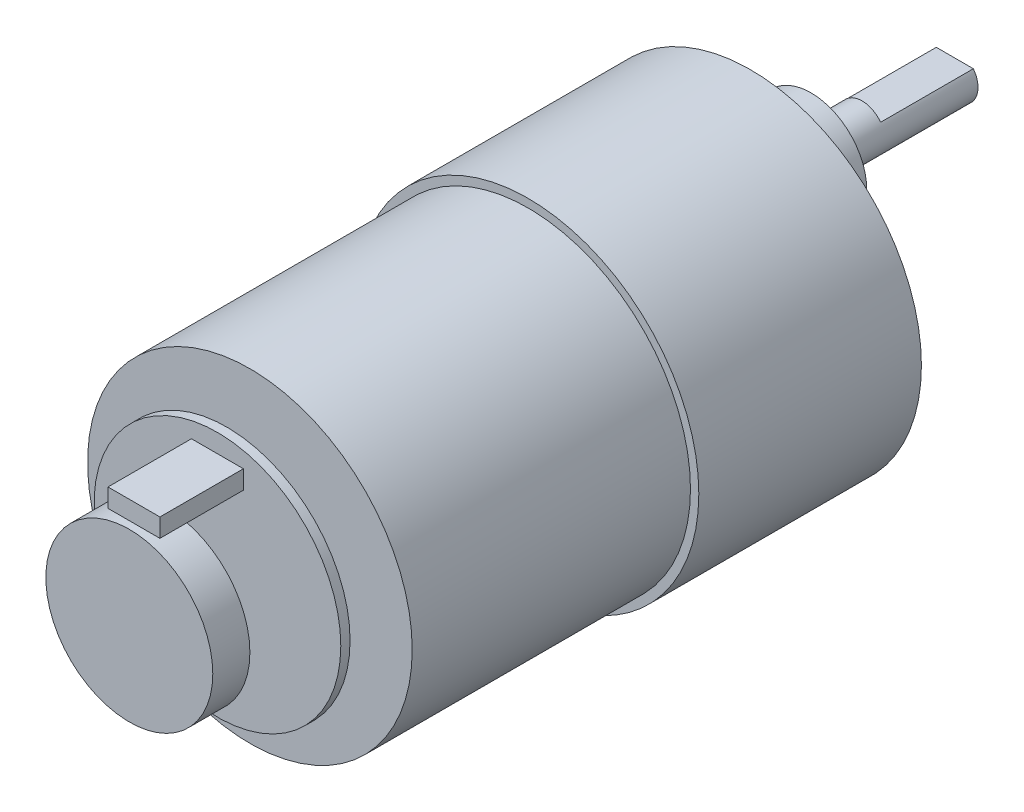
ISO-10303-21;
HEADER;
FILE_DESCRIPTION(('STEP AP214'),'2;1');
FILE_NAME('part.step','',(''),(''),'','','');
FILE_SCHEMA(('AUTOMOTIVE_DESIGN { 1 0 10303 214 1 1 1 1 }'));
ENDSEC;
DATA;
#1=APPLICATION_CONTEXT('core data for automotive mechanical design processes');
#2=APPLICATION_PROTOCOL_DEFINITION('international standard','automotive_design',2000,#1);
#3=PRODUCT_CONTEXT('',#1,'mechanical');
#4=PRODUCT('Part','Part','',(#3));
#5=PRODUCT_RELATED_PRODUCT_CATEGORY('part','',(#4));
#6=PRODUCT_DEFINITION_FORMATION('','',#4);
#7=PRODUCT_DEFINITION_CONTEXT('part definition',#1,'design');
#8=PRODUCT_DEFINITION('design','',#6,#7);
#9=PRODUCT_DEFINITION_SHAPE('','',#8);
#10=(LENGTH_UNIT() NAMED_UNIT(*) SI_UNIT(.MILLI.,.METRE.));
#11=(NAMED_UNIT(*) PLANE_ANGLE_UNIT() SI_UNIT($,.RADIAN.));
#12=(NAMED_UNIT(*) SI_UNIT($,.STERADIAN.) SOLID_ANGLE_UNIT());
#13=UNCERTAINTY_MEASURE_WITH_UNIT(LENGTH_MEASURE(1.E-05),#10,'distance_accuracy_value','');
#14=(GEOMETRIC_REPRESENTATION_CONTEXT(3) GLOBAL_UNCERTAINTY_ASSIGNED_CONTEXT((#13)) GLOBAL_UNIT_ASSIGNED_CONTEXT((#10,
#11,#12)) REPRESENTATION_CONTEXT('',''));
#15=CARTESIAN_POINT('',(0.,0.,0.));
#16=DIRECTION('',(0.,0.,1.));
#17=DIRECTION('',(1.,0.,0.));
#18=AXIS2_PLACEMENT_3D('',#15,#16,#17);
#19=CARTESIAN_POINT('',(0.,7.,-22.));
#20=DIRECTION('',(0.,0.,1.));
#21=DIRECTION('',(1.,0.,0.));
#22=AXIS2_PLACEMENT_3D('',#19,#20,#21);
#23=CYLINDRICAL_SURFACE('',#22,2.5);
#24=CARTESIAN_POINT('',(0.,7.,-6.5));
#25=DIRECTION('',(0.,0.,-1.));
#26=DIRECTION('',(-1.,0.,0.));
#27=AXIS2_PLACEMENT_3D('',#24,#25,#26);
#28=CIRCLE('',#27,2.5);
#29=CARTESIAN_POINT('',(-2.5,7.,-6.5));
#30=VERTEX_POINT('',#29);
#31=EDGE_CURVE('E192',#30,#30,#28,.T.);
#32=ORIENTED_EDGE('',*,*,#31,.T.);
#33=EDGE_LOOP('',(#32));
#34=FACE_BOUND('',#33,.T.);
#35=CARTESIAN_POINT('',(0.,7.,-12.));
#36=DIRECTION('',(0.,0.,-1.));
#37=DIRECTION('',(-1.,0.,0.));
#38=AXIS2_PLACEMENT_3D('',#35,#36,#37);
#39=CIRCLE('',#38,2.5);
#40=CARTESIAN_POINT('',(-2.,8.5,-12.));
#41=VERTEX_POINT('',#40);
#42=CARTESIAN_POINT('',(2.,8.5,-12.));
#43=VERTEX_POINT('',#42);
#44=EDGE_CURVE('E12',#41,#43,#39,.T.);
#45=ORIENTED_EDGE('',*,*,#44,.F.);
#46=DIRECTION('',(0.,0.,-1.));
#47=VECTOR('',#46,1.);
#48=CARTESIAN_POINT('',(-2.,8.5,-12.));
#49=LINE('',#48,#47);
#50=CARTESIAN_POINT('',(-2.,8.5,-22.));
#51=VERTEX_POINT('',#50);
#52=EDGE_CURVE('E90',#41,#51,#49,.T.);
#53=ORIENTED_EDGE('',*,*,#52,.T.);
#54=CARTESIAN_POINT('',(0.,7.,-22.));
#55=DIRECTION('',(0.,0.,-1.));
#56=DIRECTION('',(-1.,0.,0.));
#57=AXIS2_PLACEMENT_3D('',#54,#55,#56);
#58=CIRCLE('',#57,2.5);
#59=CARTESIAN_POINT('',(2.,8.5,-22.));
#60=VERTEX_POINT('',#59);
#61=EDGE_CURVE('E103',#60,#51,#58,.T.);
#62=ORIENTED_EDGE('',*,*,#61,.F.);
#63=DIRECTION('',(0.,0.,-1.));
#64=VECTOR('',#63,1.);
#65=CARTESIAN_POINT('',(2.,8.5,-12.));
#66=LINE('',#65,#64);
#67=EDGE_CURVE('E53',#43,#60,#66,.T.);
#68=ORIENTED_EDGE('',*,*,#67,.F.);
#69=EDGE_LOOP('',(#45,#53,#62,#68));
#70=FACE_BOUND('',#69,.T.);
#71=ADVANCED_FACE('F38',(#34,#70),#23,.T.);
#72=CARTESIAN_POINT('',(0.,7.,-22.));
#73=DIRECTION('',(0.,0.,-1.));
#74=DIRECTION('',(-1.,0.,0.));
#75=AXIS2_PLACEMENT_3D('',#72,#73,#74);
#76=PLANE('',#75);
#77=ORIENTED_EDGE('',*,*,#61,.T.);
#78=DIRECTION('',(1.,0.,0.));
#79=VECTOR('',#78,1.);
#80=CARTESIAN_POINT('',(-2.,8.5,-22.));
#81=LINE('',#80,#79);
#82=EDGE_CURVE('E94',#51,#60,#81,.T.);
#83=ORIENTED_EDGE('',*,*,#82,.T.);
#84=EDGE_LOOP('',(#77,#83));
#85=FACE_BOUND('',#84,.T.);
#86=ADVANCED_FACE('F234',(#85),#76,.T.);
#87=CARTESIAN_POINT('',(0.,0.,57.5));
#88=DIRECTION('',(0.,0.,1.));
#89=DIRECTION('',(1.,0.,0.));
#90=AXIS2_PLACEMENT_3D('',#87,#88,#89);
#91=PLANE('',#90);
#92=CARTESIAN_POINT('',(0.,0.,57.5));
#93=DIRECTION('',(0.,0.,1.));
#94=DIRECTION('',(1.,0.,0.));
#95=AXIS2_PLACEMENT_3D('',#92,#93,#94);
#96=CIRCLE('',#95,1.);
#97=CARTESIAN_POINT('',(1.,0.,57.5));
#98=VERTEX_POINT('',#97);
#99=EDGE_CURVE('E138',#98,#98,#96,.T.);
#100=ORIENTED_EDGE('',*,*,#99,.F.);
#101=EDGE_LOOP('',(#100));
#102=FACE_BOUND('',#101,.T.);
#103=CARTESIAN_POINT('',(0.,0.,57.5));
#104=DIRECTION('',(0.,0.,1.));
#105=DIRECTION('',(1.,0.,0.));
#106=AXIS2_PLACEMENT_3D('',#103,#104,#105);
#107=CIRCLE('',#106,13.3);
#108=CARTESIAN_POINT('',(13.3,0.,57.5));
#109=VERTEX_POINT('',#108);
#110=EDGE_CURVE('E147',#109,#109,#107,.T.);
#111=ORIENTED_EDGE('',*,*,#110,.T.);
#112=EDGE_LOOP('',(#111));
#113=FACE_BOUND('',#112,.T.);
#114=DIRECTION('',(-1.,0.,0.));
#115=VECTOR('',#114,1.);
#116=CARTESIAN_POINT('',(-2.8,11.3,57.5));
#117=LINE('',#116,#115);
#118=CARTESIAN_POINT('',(2.8,11.3,57.5));
#119=VERTEX_POINT('',#118);
#120=CARTESIAN_POINT('',(-2.8,11.3,57.5));
#121=VERTEX_POINT('',#120);
#122=EDGE_CURVE('E107',#119,#121,#117,.T.);
#123=ORIENTED_EDGE('',*,*,#122,.F.);
#124=DIRECTION('',(0.,1.,0.));
#125=VECTOR('',#124,1.);
#126=CARTESIAN_POINT('',(2.8,11.3,57.5));
#127=LINE('',#126,#125);
#128=CARTESIAN_POINT('',(2.8,9.3,57.5));
#129=VERTEX_POINT('',#128);
#130=EDGE_CURVE('E104',#129,#119,#127,.T.);
#131=ORIENTED_EDGE('',*,*,#130,.F.);
#132=DIRECTION('',(1.,0.,0.));
#133=VECTOR('',#132,1.);
#134=CARTESIAN_POINT('',(-2.8,9.3,57.5));
#135=LINE('',#134,#133);
#136=CARTESIAN_POINT('',(-2.8,9.3,57.5));
#137=VERTEX_POINT('',#136);
#138=EDGE_CURVE('E115',#137,#129,#135,.T.);
#139=ORIENTED_EDGE('',*,*,#138,.F.);
#140=DIRECTION('',(0.,-1.,0.));
#141=VECTOR('',#140,1.);
#142=CARTESIAN_POINT('',(-2.8,11.3,57.5));
#143=LINE('',#142,#141);
#144=EDGE_CURVE('E123',#121,#137,#143,.T.);
#145=ORIENTED_EDGE('',*,*,#144,.F.);
#146=EDGE_LOOP('',(#123,#131,#139,#145));
#147=FACE_BOUND('',#146,.T.);
#148=ADVANCED_FACE('F240',(#102,#113,#147),#91,.T.);
#149=CARTESIAN_POINT('',(0.,0.,54.));
#150=DIRECTION('',(0.,0.,1.));
#151=DIRECTION('',(1.,0.,0.));
#152=AXIS2_PLACEMENT_3D('',#149,#150,#151);
#153=PLANE('',#152);
#154=CARTESIAN_POINT('',(0.,0.,54.));
#155=DIRECTION('',(0.,0.,1.));
#156=DIRECTION('',(1.,0.,0.));
#157=AXIS2_PLACEMENT_3D('',#154,#155,#156);
#158=CIRCLE('',#157,17.5);
#159=CARTESIAN_POINT('',(17.5,0.,54.));
#160=VERTEX_POINT('',#159);
#161=EDGE_CURVE('E202',#160,#160,#158,.T.);
#162=ORIENTED_EDGE('',*,*,#161,.T.);
#163=EDGE_LOOP('',(#162));
#164=FACE_BOUND('',#163,.T.);
#165=CARTESIAN_POINT('',(0.,0.,54.));
#166=DIRECTION('',(0.,0.,1.));
#167=DIRECTION('',(1.,0.,0.));
#168=AXIS2_PLACEMENT_3D('',#165,#166,#167);
#169=CIRCLE('',#168,1.);
#170=CARTESIAN_POINT('',(1.,0.,54.));
#171=VERTEX_POINT('',#170);
#172=EDGE_CURVE('E150',#171,#171,#169,.T.);
#173=ORIENTED_EDGE('',*,*,#172,.F.);
#174=EDGE_LOOP('',(#173));
#175=FACE_BOUND('',#174,.T.);
#176=ADVANCED_FACE('F228',(#164,#175),#153,.T.);
#177=CARTESIAN_POINT('',(0.,7.,-6.5));
#178=DIRECTION('',(0.,0.,-1.));
#179=DIRECTION('',(-1.,0.,0.));
#180=AXIS2_PLACEMENT_3D('',#177,#178,#179);
#181=PLANE('',#180);
#182=CARTESIAN_POINT('',(0.,7.,-6.5));
#183=DIRECTION('',(0.,0.,-1.));
#184=DIRECTION('',(-1.,0.,0.));
#185=AXIS2_PLACEMENT_3D('',#182,#183,#184);
#186=CIRCLE('',#185,6.);
#187=CARTESIAN_POINT('',(6.,7.,-6.5));
#188=VERTEX_POINT('',#187);
#189=EDGE_CURVE('E196',#188,#188,#186,.T.);
#190=ORIENTED_EDGE('',*,*,#189,.T.);
#191=EDGE_LOOP('',(#190));
#192=FACE_BOUND('',#191,.T.);
#193=ORIENTED_EDGE('',*,*,#31,.F.);
#194=EDGE_LOOP('',(#193));
#195=FACE_BOUND('',#194,.T.);
#196=ADVANCED_FACE('F220',(#192,#195),#181,.T.);
#197=CARTESIAN_POINT('',(0.,0.,0.));
#198=DIRECTION('',(0.,0.,1.));
#199=DIRECTION('',(1.,0.,0.));
#200=AXIS2_PLACEMENT_3D('',#197,#198,#199);
#201=PLANE('',#200);
#202=CARTESIAN_POINT('',(7.48592515374054,12.9660027079352,0.));
#203=DIRECTION('',(0.,0.,-1.));
#204=DIRECTION('',(-1.,0.,0.));
#205=AXIS2_PLACEMENT_3D('',#202,#203,#204);
#206=CIRCLE('',#205,1.50000000000132);
#207=CARTESIAN_POINT('',(5.98592515373922,12.9660027079352,0.));
#208=VERTEX_POINT('',#207);
#209=EDGE_CURVE('E156',#208,#208,#206,.T.);
#210=ORIENTED_EDGE('',*,*,#209,.F.);
#211=EDGE_LOOP('',(#210));
#212=FACE_BOUND('',#211,.T.);
#213=CARTESIAN_POINT('',(14.9718503074802,-1.48405593369816E-12,0.));
#214=DIRECTION('',(0.,0.,-1.));
#215=DIRECTION('',(-1.,0.,0.));
#216=AXIS2_PLACEMENT_3D('',#213,#214,#215);
#217=CIRCLE('',#216,1.50000000000132);
#218=CARTESIAN_POINT('',(13.4718503074788,-1.48405593369816E-12,0.));
#219=VERTEX_POINT('',#218);
#220=EDGE_CURVE('E162',#219,#219,#217,.T.);
#221=ORIENTED_EDGE('',*,*,#220,.F.);
#222=EDGE_LOOP('',(#221));
#223=FACE_BOUND('',#222,.T.);
#224=CARTESIAN_POINT('',(7.48592515373903,-12.9660027079373,0.));
#225=DIRECTION('',(0.,0.,-1.));
#226=DIRECTION('',(-1.,0.,0.));
#227=AXIS2_PLACEMENT_3D('',#224,#225,#226);
#228=CIRCLE('',#227,1.50000000000132);
#229=CARTESIAN_POINT('',(5.98592515373771,-12.9660027079373,0.));
#230=VERTEX_POINT('',#229);
#231=EDGE_CURVE('E168',#230,#230,#228,.T.);
#232=ORIENTED_EDGE('',*,*,#231,.F.);
#233=EDGE_LOOP('',(#232));
#234=FACE_BOUND('',#233,.T.);
#235=CARTESIAN_POINT('',(-7.48592515374175,-12.9660027079364,0.));
#236=DIRECTION('',(0.,0.,-1.));
#237=DIRECTION('',(-1.,0.,0.));
#238=AXIS2_PLACEMENT_3D('',#235,#236,#237);
#239=CIRCLE('',#238,1.50000000000132);
#240=CARTESIAN_POINT('',(-8.98592515374308,-12.9660027079364,0.));
#241=VERTEX_POINT('',#240);
#242=EDGE_CURVE('E174',#241,#241,#239,.T.);
#243=ORIENTED_EDGE('',*,*,#242,.F.);
#244=EDGE_LOOP('',(#243));
#245=FACE_BOUND('',#244,.T.);
#246=CARTESIAN_POINT('',(-14.9718503074814,2.64545330086463E-13,0.));
#247=DIRECTION('',(0.,0.,-1.));
#248=DIRECTION('',(-1.,0.,0.));
#249=AXIS2_PLACEMENT_3D('',#246,#247,#248);
#250=CIRCLE('',#249,1.50000000000132);
#251=CARTESIAN_POINT('',(-16.4718503074827,2.64545330086463E-13,0.));
#252=VERTEX_POINT('',#251);
#253=EDGE_CURVE('E180',#252,#252,#250,.T.);
#254=ORIENTED_EDGE('',*,*,#253,.F.);
#255=EDGE_LOOP('',(#254));
#256=FACE_BOUND('',#255,.T.);
#257=CARTESIAN_POINT('',(-7.48592515374025,12.966002707936,0.));
#258=DIRECTION('',(0.,0.,-1.));
#259=DIRECTION('',(-1.,0.,0.));
#260=AXIS2_PLACEMENT_3D('',#257,#258,#259);
#261=CIRCLE('',#260,1.50000000000132);
#262=CARTESIAN_POINT('',(-8.98592515374157,12.966002707936,0.));
#263=VERTEX_POINT('',#262);
#264=EDGE_CURVE('E186',#263,#263,#261,.T.);
#265=ORIENTED_EDGE('',*,*,#264,.F.);
#266=EDGE_LOOP('',(#265));
#267=FACE_BOUND('',#266,.T.);
#268=CARTESIAN_POINT('',(0.,0.,0.));
#269=DIRECTION('',(0.,0.,1.));
#270=DIRECTION('',(1.,0.,0.));
#271=AXIS2_PLACEMENT_3D('',#268,#269,#270);
#272=CIRCLE('',#271,18.4);
#273=CARTESIAN_POINT('',(18.4,0.,0.));
#274=VERTEX_POINT('',#273);
#275=EDGE_CURVE('E205',#274,#274,#272,.T.);
#276=ORIENTED_EDGE('',*,*,#275,.F.);
#277=EDGE_LOOP('',(#276));
#278=FACE_BOUND('',#277,.T.);
#279=CARTESIAN_POINT('',(0.,7.,0.));
#280=DIRECTION('',(0.,0.,1.));
#281=DIRECTION('',(1.,0.,0.));
#282=AXIS2_PLACEMENT_3D('',#279,#280,#281);
#283=CIRCLE('',#282,6.);
#284=CARTESIAN_POINT('',(6.,7.,0.));
#285=VERTEX_POINT('',#284);
#286=EDGE_CURVE('E46',#285,#285,#283,.F.);
#287=ORIENTED_EDGE('',*,*,#286,.F.);
#288=EDGE_LOOP('',(#287));
#289=FACE_BOUND('',#288,.T.);
#290=ADVANCED_FACE('F217',(#212,#223,#234,#245,#256,#267,#278,#289),#201,.F.);
#291=CARTESIAN_POINT('',(0.,0.,24.));
#292=DIRECTION('',(0.,0.,1.));
#293=DIRECTION('',(1.,0.,0.));
#294=AXIS2_PLACEMENT_3D('',#291,#292,#293);
#295=PLANE('',#294);
#296=CARTESIAN_POINT('',(0.,0.,24.));
#297=DIRECTION('',(0.,0.,1.));
#298=DIRECTION('',(1.,0.,0.));
#299=AXIS2_PLACEMENT_3D('',#296,#297,#298);
#300=CIRCLE('',#299,18.4);
#301=CARTESIAN_POINT('',(18.4,0.,24.));
#302=VERTEX_POINT('',#301);
#303=EDGE_CURVE('E208',#302,#302,#300,.T.);
#304=ORIENTED_EDGE('',*,*,#303,.T.);
#305=EDGE_LOOP('',(#304));
#306=FACE_BOUND('',#305,.T.);
#307=CARTESIAN_POINT('',(0.,0.,24.));
#308=DIRECTION('',(0.,0.,1.));
#309=DIRECTION('',(1.,0.,0.));
#310=AXIS2_PLACEMENT_3D('',#307,#308,#309);
#311=CIRCLE('',#310,17.5);
#312=CARTESIAN_POINT('',(17.5,0.,24.));
#313=VERTEX_POINT('',#312);
#314=EDGE_CURVE('E201',#313,#313,#311,.T.);
#315=ORIENTED_EDGE('',*,*,#314,.F.);
#316=EDGE_LOOP('',(#315));
#317=FACE_BOUND('',#316,.T.);
#318=ADVANCED_FACE('F219',(#306,#317),#295,.T.);
#319=CARTESIAN_POINT('',(0.,0.,24.));
#320=DIRECTION('',(0.,0.,-1.));
#321=DIRECTION('',(-1.,0.,0.));
#322=AXIS2_PLACEMENT_3D('',#319,#320,#321);
#323=CYLINDRICAL_SURFACE('',#322,18.4);
#324=ORIENTED_EDGE('',*,*,#303,.F.);
#325=EDGE_LOOP('',(#324));
#326=FACE_BOUND('',#325,.T.);
#327=ORIENTED_EDGE('',*,*,#275,.T.);
#328=EDGE_LOOP('',(#327));
#329=FACE_BOUND('',#328,.T.);
#330=ADVANCED_FACE('F40',(#326,#329),#323,.T.);
#331=CARTESIAN_POINT('',(0.,0.,54.));
#332=DIRECTION('',(0.,0.,-1.));
#333=DIRECTION('',(-1.,0.,0.));
#334=AXIS2_PLACEMENT_3D('',#331,#332,#333);
#335=CYLINDRICAL_SURFACE('',#334,17.5);
#336=ORIENTED_EDGE('',*,*,#161,.F.);
#337=EDGE_LOOP('',(#336));
#338=FACE_BOUND('',#337,.T.);
#339=ORIENTED_EDGE('',*,*,#314,.T.);
#340=EDGE_LOOP('',(#339));
#341=FACE_BOUND('',#340,.T.);
#342=ADVANCED_FACE('F248',(#338,#341),#335,.T.);
#343=CARTESIAN_POINT('',(0.,7.,-6.5));
#344=DIRECTION('',(0.,0.,1.));
#345=DIRECTION('',(1.,0.,0.));
#346=AXIS2_PLACEMENT_3D('',#343,#344,#345);
#347=CYLINDRICAL_SURFACE('',#346,6.);
#348=CARTESIAN_POINT('',(6.,7.,-6.5));
#349=CARTESIAN_POINT('',(6.,7.,-6.43229166666667));
#350=CARTESIAN_POINT('',(6.,7.,-6.36458333333333));
#351=CARTESIAN_POINT('',(6.,7.,-6.22916666666667));
#352=CARTESIAN_POINT('',(6.,7.,-6.16145833333333));
#353=CARTESIAN_POINT('',(6.,7.,-6.02604166666667));
#354=CARTESIAN_POINT('',(6.,7.,-5.95833333333333));
#355=CARTESIAN_POINT('',(6.,7.,-5.82291666666667));
#356=CARTESIAN_POINT('',(6.,7.,-5.75520833333333));
#357=CARTESIAN_POINT('',(6.,7.,-5.61979166666667));
#358=CARTESIAN_POINT('',(6.,7.,-5.55208333333333));
#359=CARTESIAN_POINT('',(6.,7.,-5.41666666666667));
#360=CARTESIAN_POINT('',(6.,7.,-5.34895833333333));
#361=CARTESIAN_POINT('',(6.,7.,-5.21354166666667));
#362=CARTESIAN_POINT('',(6.,7.,-5.14583333333333));
#363=CARTESIAN_POINT('',(6.,7.,-5.01041666666667));
#364=CARTESIAN_POINT('',(6.,7.,-4.94270833333333));
#365=CARTESIAN_POINT('',(6.,7.,-4.80729166666667));
#366=CARTESIAN_POINT('',(6.,7.,-4.73958333333333));
#367=CARTESIAN_POINT('',(6.,7.,-4.60416666666667));
#368=CARTESIAN_POINT('',(6.,7.,-4.53645833333333));
#369=CARTESIAN_POINT('',(6.,7.,-4.40104166666667));
#370=CARTESIAN_POINT('',(6.,7.,-4.33333333333333));
#371=CARTESIAN_POINT('',(6.,7.,-4.19791666666667));
#372=CARTESIAN_POINT('',(6.,7.,-4.13020833333333));
#373=CARTESIAN_POINT('',(6.,7.,-3.99479166666667));
#374=CARTESIAN_POINT('',(6.,7.,-3.92708333333333));
#375=CARTESIAN_POINT('',(6.,7.,-3.79166666666667));
#376=CARTESIAN_POINT('',(6.,7.,-3.72395833333333));
#377=CARTESIAN_POINT('',(6.,7.,-3.58854166666667));
#378=CARTESIAN_POINT('',(6.,7.,-3.52083333333333));
#379=CARTESIAN_POINT('',(6.,7.,-3.38541666666667));
#380=CARTESIAN_POINT('',(6.,7.,-3.31770833333333));
#381=CARTESIAN_POINT('',(6.,7.,-3.18229166666667));
#382=CARTESIAN_POINT('',(6.,7.,-3.11458333333333));
#383=CARTESIAN_POINT('',(6.,7.,-2.97916666666667));
#384=CARTESIAN_POINT('',(6.,7.,-2.91145833333333));
#385=CARTESIAN_POINT('',(6.,7.,-2.77604166666667));
#386=CARTESIAN_POINT('',(6.,7.,-2.70833333333333));
#387=CARTESIAN_POINT('',(6.,7.,-2.57291666666667));
#388=CARTESIAN_POINT('',(6.,7.,-2.50520833333333));
#389=CARTESIAN_POINT('',(6.,7.,-2.36979166666667));
#390=CARTESIAN_POINT('',(6.,7.,-2.30208333333333));
#391=CARTESIAN_POINT('',(6.,7.,-2.16666666666667));
#392=CARTESIAN_POINT('',(6.,7.,-2.09895833333333));
#393=CARTESIAN_POINT('',(6.,7.,-1.96354166666667));
#394=CARTESIAN_POINT('',(6.,7.,-1.89583333333333));
#395=CARTESIAN_POINT('',(6.,7.,-1.76041666666667));
#396=CARTESIAN_POINT('',(6.,7.,-1.69270833333333));
#397=CARTESIAN_POINT('',(6.,7.,-1.55729166666667));
#398=CARTESIAN_POINT('',(6.,7.,-1.48958333333333));
#399=CARTESIAN_POINT('',(6.,7.,-1.35416666666667));
#400=CARTESIAN_POINT('',(6.,7.,-1.28645833333333));
#401=CARTESIAN_POINT('',(6.,7.,-1.15104166666667));
#402=CARTESIAN_POINT('',(6.,7.,-1.08333333333333));
#403=CARTESIAN_POINT('',(6.,7.,-0.947916666666667));
#404=CARTESIAN_POINT('',(6.,7.,-0.880208333333333));
#405=CARTESIAN_POINT('',(6.,7.,-0.744791666666667));
#406=CARTESIAN_POINT('',(6.,7.,-0.677083333333333));
#407=CARTESIAN_POINT('',(6.,7.,-0.541666666666667));
#408=CARTESIAN_POINT('',(6.,7.,-0.473958333333333));
#409=CARTESIAN_POINT('',(6.,7.,-0.338541666666667));
#410=CARTESIAN_POINT('',(6.,7.,-0.270833333333334));
#411=CARTESIAN_POINT('',(6.,7.,-0.135416666666667));
#412=CARTESIAN_POINT('',(6.,7.,-0.0677083333333334));
#413=CARTESIAN_POINT('',(6.,7.,0.));
#414=B_SPLINE_CURVE_WITH_KNOTS('',3,(#348,#349,#350,#351,#352,#353,#354,#355,#356,#357,#358,
#359,#360,#361,#362,#363,#364,#365,#366,#367,#368,#369,#370,#371,#372,#373,#374,#375,#376,#377,
#378,#379,#380,#381,#382,#383,#384,#385,#386,#387,#388,#389,#390,#391,#392,#393,#394,#395,#396,
#397,#398,#399,#400,#401,#402,#403,#404,#405,#406,#407,#408,#409,#410,#411,#412,#413),
.UNSPECIFIED.,.F.,.F.,(4,2,2,2,2,2,2,2,2,2,2,2,2,2,2,2,2,2,2,2,2,2,2,2,2,2,2,2,2,2,2,2,4),(0.,
0.203125,0.40625,0.609375000000001,0.812500000000001,1.015625,1.21875,1.421875,1.625,1.828125,
2.03125,2.234375,2.4375,2.640625,2.84375,3.046875,3.25,3.453125,3.65625,3.859375,4.0625,
4.265625,4.46875,4.671875,4.875,5.078125,5.28125,5.484375,5.6875,5.890625,6.09375,6.296875,6.5),.UNSPECIFIED.);
#415=EDGE_CURVE('BSEAM215',#188,#285,#414,.T.);
#416=ORIENTED_EDGE('',*,*,#189,.F.);
#417=ORIENTED_EDGE('',*,*,#286,.T.);
#418=ORIENTED_EDGE('',*,*,#415,.T.);
#419=ORIENTED_EDGE('',*,*,#415,.F.);
#420=EDGE_LOOP('',(#416,#418,#417,#419));
#421=FACE_BOUND('',#420,.T.);
#422=ADVANCED_FACE('F215',(#421),#347,.T.);
#423=CARTESIAN_POINT('',(-7.48592515374025,12.966002707936,10.));
#424=DIRECTION('',(0.,0.,-1.));
#425=DIRECTION('',(-1.,0.,0.));
#426=AXIS2_PLACEMENT_3D('',#423,#424,#425);
#427=CYLINDRICAL_SURFACE('',#426,1.50000000000132);
#428=CARTESIAN_POINT('',(-7.48592515374025,12.966002707936,10.));
#429=DIRECTION('',(0.,0.,-1.));
#430=DIRECTION('',(-1.,0.,0.));
#431=AXIS2_PLACEMENT_3D('',#428,#429,#430);
#432=CIRCLE('',#431,1.50000000000132);
#433=CARTESIAN_POINT('',(-8.98592515374157,12.966002707936,10.));
#434=VERTEX_POINT('',#433);
#435=EDGE_CURVE('E189',#434,#434,#432,.T.);
#436=ORIENTED_EDGE('',*,*,#435,.F.);
#437=EDGE_LOOP('',(#436));
#438=FACE_BOUND('',#437,.T.);
#439=ORIENTED_EDGE('',*,*,#264,.T.);
#440=EDGE_LOOP('',(#439));
#441=FACE_BOUND('',#440,.T.);
#442=ADVANCED_FACE('F247',(#438,#441),#427,.F.);
#443=CARTESIAN_POINT('',(-7.48592515374025,12.966002707936,10.));
#444=DIRECTION('',(0.,0.,-1.));
#445=DIRECTION('',(-1.,0.,0.));
#446=AXIS2_PLACEMENT_3D('',#443,#444,#445);
#447=PLANE('',#446);
#448=ORIENTED_EDGE('',*,*,#435,.T.);
#449=EDGE_LOOP('',(#448));
#450=FACE_BOUND('',#449,.T.);
#451=ADVANCED_FACE('F319',(#450),#447,.T.);
#452=CARTESIAN_POINT('',(-14.9718503074814,2.64545330086463E-13,10.));
#453=DIRECTION('',(0.,0.,-1.));
#454=DIRECTION('',(-1.,0.,0.));
#455=AXIS2_PLACEMENT_3D('',#452,#453,#454);
#456=CYLINDRICAL_SURFACE('',#455,1.50000000000132);
#457=CARTESIAN_POINT('',(-14.9718503074814,2.64545330086463E-13,10.));
#458=DIRECTION('',(0.,0.,-1.));
#459=DIRECTION('',(-1.,0.,0.));
#460=AXIS2_PLACEMENT_3D('',#457,#458,#459);
#461=CIRCLE('',#460,1.50000000000132);
#462=CARTESIAN_POINT('',(-16.4718503074827,2.64545330086463E-13,10.));
#463=VERTEX_POINT('',#462);
#464=EDGE_CURVE('E183',#463,#463,#461,.T.);
#465=ORIENTED_EDGE('',*,*,#464,.F.);
#466=EDGE_LOOP('',(#465));
#467=FACE_BOUND('',#466,.T.);
#468=ORIENTED_EDGE('',*,*,#253,.T.);
#469=EDGE_LOOP('',(#468));
#470=FACE_BOUND('',#469,.T.);
#471=ADVANCED_FACE('F315',(#467,#470),#456,.F.);
#472=CARTESIAN_POINT('',(-14.9718503074814,2.64545330086463E-13,10.));
#473=DIRECTION('',(0.,0.,-1.));
#474=DIRECTION('',(-1.,0.,0.));
#475=AXIS2_PLACEMENT_3D('',#472,#473,#474);
#476=PLANE('',#475);
#477=ORIENTED_EDGE('',*,*,#464,.T.);
#478=EDGE_LOOP('',(#477));
#479=FACE_BOUND('',#478,.T.);
#480=ADVANCED_FACE('F311',(#479),#476,.T.);
#481=CARTESIAN_POINT('',(-7.48592515374175,-12.9660027079364,10.));
#482=DIRECTION('',(0.,0.,-1.));
#483=DIRECTION('',(-1.,0.,0.));
#484=AXIS2_PLACEMENT_3D('',#481,#482,#483);
#485=CYLINDRICAL_SURFACE('',#484,1.50000000000132);
#486=CARTESIAN_POINT('',(-7.48592515374175,-12.9660027079364,10.));
#487=DIRECTION('',(0.,0.,-1.));
#488=DIRECTION('',(-1.,0.,0.));
#489=AXIS2_PLACEMENT_3D('',#486,#487,#488);
#490=CIRCLE('',#489,1.50000000000132);
#491=CARTESIAN_POINT('',(-8.98592515374308,-12.9660027079364,10.));
#492=VERTEX_POINT('',#491);
#493=EDGE_CURVE('E177',#492,#492,#490,.T.);
#494=ORIENTED_EDGE('',*,*,#493,.F.);
#495=EDGE_LOOP('',(#494));
#496=FACE_BOUND('',#495,.T.);
#497=ORIENTED_EDGE('',*,*,#242,.T.);
#498=EDGE_LOOP('',(#497));
#499=FACE_BOUND('',#498,.T.);
#500=ADVANCED_FACE('F307',(#496,#499),#485,.F.);
#501=CARTESIAN_POINT('',(-7.48592515374175,-12.9660027079364,10.));
#502=DIRECTION('',(0.,0.,-1.));
#503=DIRECTION('',(-1.,0.,0.));
#504=AXIS2_PLACEMENT_3D('',#501,#502,#503);
#505=PLANE('',#504);
#506=ORIENTED_EDGE('',*,*,#493,.T.);
#507=EDGE_LOOP('',(#506));
#508=FACE_BOUND('',#507,.T.);
#509=ADVANCED_FACE('F303',(#508),#505,.T.);
#510=CARTESIAN_POINT('',(7.48592515373903,-12.9660027079373,10.));
#511=DIRECTION('',(0.,0.,-1.));
#512=DIRECTION('',(-1.,0.,0.));
#513=AXIS2_PLACEMENT_3D('',#510,#511,#512);
#514=CYLINDRICAL_SURFACE('',#513,1.50000000000132);
#515=CARTESIAN_POINT('',(7.48592515373903,-12.9660027079373,10.));
#516=DIRECTION('',(0.,0.,-1.));
#517=DIRECTION('',(-1.,0.,0.));
#518=AXIS2_PLACEMENT_3D('',#515,#516,#517);
#519=CIRCLE('',#518,1.50000000000132);
#520=CARTESIAN_POINT('',(5.98592515373771,-12.9660027079373,10.));
#521=VERTEX_POINT('',#520);
#522=EDGE_CURVE('E171',#521,#521,#519,.T.);
#523=ORIENTED_EDGE('',*,*,#522,.F.);
#524=EDGE_LOOP('',(#523));
#525=FACE_BOUND('',#524,.T.);
#526=ORIENTED_EDGE('',*,*,#231,.T.);
#527=EDGE_LOOP('',(#526));
#528=FACE_BOUND('',#527,.T.);
#529=ADVANCED_FACE('F299',(#525,#528),#514,.F.);
#530=CARTESIAN_POINT('',(7.48592515373903,-12.9660027079373,10.));
#531=DIRECTION('',(0.,0.,-1.));
#532=DIRECTION('',(-1.,0.,0.));
#533=AXIS2_PLACEMENT_3D('',#530,#531,#532);
#534=PLANE('',#533);
#535=ORIENTED_EDGE('',*,*,#522,.T.);
#536=EDGE_LOOP('',(#535));
#537=FACE_BOUND('',#536,.T.);
#538=ADVANCED_FACE('F295',(#537),#534,.T.);
#539=CARTESIAN_POINT('',(14.9718503074802,-1.48405593369816E-12,10.));
#540=DIRECTION('',(0.,0.,-1.));
#541=DIRECTION('',(-1.,0.,0.));
#542=AXIS2_PLACEMENT_3D('',#539,#540,#541);
#543=CYLINDRICAL_SURFACE('',#542,1.50000000000132);
#544=CARTESIAN_POINT('',(14.9718503074802,-1.48405593369816E-12,10.));
#545=DIRECTION('',(0.,0.,-1.));
#546=DIRECTION('',(-1.,0.,0.));
#547=AXIS2_PLACEMENT_3D('',#544,#545,#546);
#548=CIRCLE('',#547,1.50000000000132);
#549=CARTESIAN_POINT('',(13.4718503074788,-1.48405593369816E-12,10.));
#550=VERTEX_POINT('',#549);
#551=EDGE_CURVE('E165',#550,#550,#548,.T.);
#552=ORIENTED_EDGE('',*,*,#551,.F.);
#553=EDGE_LOOP('',(#552));
#554=FACE_BOUND('',#553,.T.);
#555=ORIENTED_EDGE('',*,*,#220,.T.);
#556=EDGE_LOOP('',(#555));
#557=FACE_BOUND('',#556,.T.);
#558=ADVANCED_FACE('F291',(#554,#557),#543,.F.);
#559=CARTESIAN_POINT('',(14.9718503074802,-1.48405593369816E-12,10.));
#560=DIRECTION('',(0.,0.,-1.));
#561=DIRECTION('',(-1.,0.,0.));
#562=AXIS2_PLACEMENT_3D('',#559,#560,#561);
#563=PLANE('',#562);
#564=ORIENTED_EDGE('',*,*,#551,.T.);
#565=EDGE_LOOP('',(#564));
#566=FACE_BOUND('',#565,.T.);
#567=ADVANCED_FACE('F287',(#566),#563,.T.);
#568=CARTESIAN_POINT('',(7.48592515374054,12.9660027079352,10.));
#569=DIRECTION('',(0.,0.,-1.));
#570=DIRECTION('',(-1.,0.,0.));
#571=AXIS2_PLACEMENT_3D('',#568,#569,#570);
#572=CYLINDRICAL_SURFACE('',#571,1.50000000000132);
#573=CARTESIAN_POINT('',(7.48592515374054,12.9660027079352,10.));
#574=DIRECTION('',(0.,0.,-1.));
#575=DIRECTION('',(-1.,0.,0.));
#576=AXIS2_PLACEMENT_3D('',#573,#574,#575);
#577=CIRCLE('',#576,1.50000000000132);
#578=CARTESIAN_POINT('',(5.98592515373922,12.9660027079352,10.));
#579=VERTEX_POINT('',#578);
#580=EDGE_CURVE('E159',#579,#579,#577,.T.);
#581=ORIENTED_EDGE('',*,*,#580,.F.);
#582=EDGE_LOOP('',(#581));
#583=FACE_BOUND('',#582,.T.);
#584=ORIENTED_EDGE('',*,*,#209,.T.);
#585=EDGE_LOOP('',(#584));
#586=FACE_BOUND('',#585,.T.);
#587=ADVANCED_FACE('F279',(#583,#586),#572,.F.);
#588=CARTESIAN_POINT('',(7.48592515374054,12.9660027079352,10.));
#589=DIRECTION('',(0.,0.,-1.));
#590=DIRECTION('',(-1.,0.,0.));
#591=AXIS2_PLACEMENT_3D('',#588,#589,#590);
#592=PLANE('',#591);
#593=ORIENTED_EDGE('',*,*,#580,.T.);
#594=EDGE_LOOP('',(#593));
#595=FACE_BOUND('',#594,.T.);
#596=ADVANCED_FACE('F269',(#595),#592,.T.);
#597=CARTESIAN_POINT('',(0.,0.,56.5));
#598=DIRECTION('',(0.,0.,-1.));
#599=DIRECTION('',(-1.,0.,0.));
#600=AXIS2_PLACEMENT_3D('',#597,#598,#599);
#601=CYLINDRICAL_SURFACE('',#600,1.);
#602=CARTESIAN_POINT('',(0.,0.,56.5));
#603=DIRECTION('',(0.,0.,1.));
#604=DIRECTION('',(1.,0.,0.));
#605=AXIS2_PLACEMENT_3D('',#602,#603,#604);
#606=CIRCLE('',#605,1.);
#607=CARTESIAN_POINT('',(1.,0.,56.5));
#608=VERTEX_POINT('',#607);
#609=EDGE_CURVE('E153',#608,#608,#606,.T.);
#610=ORIENTED_EDGE('',*,*,#609,.F.);
#611=EDGE_LOOP('',(#610));
#612=FACE_BOUND('',#611,.T.);
#613=ORIENTED_EDGE('',*,*,#172,.T.);
#614=EDGE_LOOP('',(#613));
#615=FACE_BOUND('',#614,.T.);
#616=ADVANCED_FACE('F266',(#612,#615),#601,.T.);
#617=CARTESIAN_POINT('',(0.,0.,56.5));
#618=DIRECTION('',(0.,0.,1.));
#619=DIRECTION('',(1.,0.,0.));
#620=AXIS2_PLACEMENT_3D('',#617,#618,#619);
#621=PLANE('',#620);
#622=CARTESIAN_POINT('',(0.,0.,56.5));
#623=DIRECTION('',(0.,0.,1.));
#624=DIRECTION('',(1.,0.,0.));
#625=AXIS2_PLACEMENT_3D('',#622,#623,#624);
#626=CIRCLE('',#625,13.3);
#627=CARTESIAN_POINT('',(13.3,0.,56.5));
#628=VERTEX_POINT('',#627);
#629=EDGE_CURVE('E144',#628,#628,#626,.T.);
#630=ORIENTED_EDGE('',*,*,#629,.F.);
#631=EDGE_LOOP('',(#630));
#632=FACE_BOUND('',#631,.T.);
#633=ORIENTED_EDGE('',*,*,#609,.T.);
#634=EDGE_LOOP('',(#633));
#635=FACE_BOUND('',#634,.T.);
#636=ADVANCED_FACE('F268',(#632,#635),#621,.F.);
#637=CARTESIAN_POINT('',(0.,0.,57.5));
#638=DIRECTION('',(0.,0.,-1.));
#639=DIRECTION('',(-1.,0.,0.));
#640=AXIS2_PLACEMENT_3D('',#637,#638,#639);
#641=CYLINDRICAL_SURFACE('',#640,13.3);
#642=ORIENTED_EDGE('',*,*,#110,.F.);
#643=EDGE_LOOP('',(#642));
#644=FACE_BOUND('',#643,.T.);
#645=ORIENTED_EDGE('',*,*,#629,.T.);
#646=EDGE_LOOP('',(#645));
#647=FACE_BOUND('',#646,.T.);
#648=ADVANCED_FACE('F276',(#644,#647),#641,.T.);
#649=CARTESIAN_POINT('',(0.,0.,63.));
#650=DIRECTION('',(0.,0.,-1.));
#651=DIRECTION('',(-1.,0.,0.));
#652=AXIS2_PLACEMENT_3D('',#649,#650,#651);
#653=CYLINDRICAL_SURFACE('',#652,1.);
#654=CARTESIAN_POINT('',(0.,0.,63.));
#655=DIRECTION('',(0.,0.,1.));
#656=DIRECTION('',(1.,0.,0.));
#657=AXIS2_PLACEMENT_3D('',#654,#655,#656);
#658=CIRCLE('',#657,1.);
#659=CARTESIAN_POINT('',(1.,0.,63.));
#660=VERTEX_POINT('',#659);
#661=EDGE_CURVE('E141',#660,#660,#658,.T.);
#662=ORIENTED_EDGE('',*,*,#661,.F.);
#663=EDGE_LOOP('',(#662));
#664=FACE_BOUND('',#663,.T.);
#665=ORIENTED_EDGE('',*,*,#99,.T.);
#666=EDGE_LOOP('',(#665));
#667=FACE_BOUND('',#666,.T.);
#668=ADVANCED_FACE('F406',(#664,#667),#653,.T.);
#669=CARTESIAN_POINT('',(0.,0.,63.));
#670=DIRECTION('',(0.,0.,1.));
#671=DIRECTION('',(1.,0.,0.));
#672=AXIS2_PLACEMENT_3D('',#669,#670,#671);
#673=PLANE('',#672);
#674=CARTESIAN_POINT('',(0.,0.,63.));
#675=DIRECTION('',(0.,0.,1.));
#676=DIRECTION('',(1.,0.,0.));
#677=AXIS2_PLACEMENT_3D('',#674,#675,#676);
#678=CIRCLE('',#677,9.);
#679=CARTESIAN_POINT('',(9.,0.,63.));
#680=VERTEX_POINT('',#679);
#681=EDGE_CURVE('E134',#680,#680,#678,.T.);
#682=ORIENTED_EDGE('',*,*,#681,.F.);
#683=EDGE_LOOP('',(#682));
#684=FACE_BOUND('',#683,.T.);
#685=ORIENTED_EDGE('',*,*,#661,.T.);
#686=EDGE_LOOP('',(#685));
#687=FACE_BOUND('',#686,.T.);
#688=ADVANCED_FACE('F415',(#684,#687),#673,.F.);
#689=CARTESIAN_POINT('',(0.,0.,67.));
#690=DIRECTION('',(0.,0.,-1.));
#691=DIRECTION('',(-1.,0.,0.));
#692=AXIS2_PLACEMENT_3D('',#689,#690,#691);
#693=CYLINDRICAL_SURFACE('',#692,9.);
#694=CARTESIAN_POINT('',(0.,0.,67.));
#695=DIRECTION('',(0.,0.,1.));
#696=DIRECTION('',(1.,0.,0.));
#697=AXIS2_PLACEMENT_3D('',#694,#695,#696);
#698=CIRCLE('',#697,9.);
#699=CARTESIAN_POINT('',(9.,0.,67.));
#700=VERTEX_POINT('',#699);
#701=EDGE_CURVE('E135',#700,#700,#698,.T.);
#702=ORIENTED_EDGE('',*,*,#701,.F.);
#703=EDGE_LOOP('',(#702));
#704=FACE_BOUND('',#703,.T.);
#705=ORIENTED_EDGE('',*,*,#681,.T.);
#706=EDGE_LOOP('',(#705));
#707=FACE_BOUND('',#706,.T.);
#708=ADVANCED_FACE('F425',(#704,#707),#693,.T.);
#709=CARTESIAN_POINT('',(0.,0.,67.));
#710=DIRECTION('',(0.,0.,1.));
#711=DIRECTION('',(1.,0.,0.));
#712=AXIS2_PLACEMENT_3D('',#709,#710,#711);
#713=PLANE('',#712);
#714=ORIENTED_EDGE('',*,*,#701,.T.);
#715=EDGE_LOOP('',(#714));
#716=FACE_BOUND('',#715,.T.);
#717=ADVANCED_FACE('F435',(#716),#713,.T.);
#718=CARTESIAN_POINT('',(2.8,11.3,66.5));
#719=DIRECTION('',(-1.,0.,0.));
#720=DIRECTION('',(0.,0.,1.));
#721=AXIS2_PLACEMENT_3D('',#718,#719,#720);
#722=PLANE('',#721);
#723=ORIENTED_EDGE('',*,*,#130,.T.);
#724=DIRECTION('',(0.,0.,-1.));
#725=VECTOR('',#724,1.);
#726=CARTESIAN_POINT('',(2.8,11.3,66.5));
#727=LINE('',#726,#725);
#728=CARTESIAN_POINT('',(2.8,11.3,66.5));
#729=VERTEX_POINT('',#728);
#730=EDGE_CURVE('E132',#729,#119,#727,.T.);
#731=ORIENTED_EDGE('',*,*,#730,.F.);
#732=DIRECTION('',(0.,1.,0.));
#733=VECTOR('',#732,1.);
#734=CARTESIAN_POINT('',(2.8,11.3,66.5));
#735=LINE('',#734,#733);
#736=CARTESIAN_POINT('',(2.8,9.3,66.5));
#737=VERTEX_POINT('',#736);
#738=EDGE_CURVE('E111',#737,#729,#735,.T.);
#739=ORIENTED_EDGE('',*,*,#738,.F.);
#740=DIRECTION('',(0.,0.,-1.));
#741=VECTOR('',#740,1.);
#742=CARTESIAN_POINT('',(2.8,9.3,66.5));
#743=LINE('',#742,#741);
#744=EDGE_CURVE('E120',#737,#129,#743,.T.);
#745=ORIENTED_EDGE('',*,*,#744,.T.);
#746=EDGE_LOOP('',(#723,#731,#739,#745));
#747=FACE_BOUND('',#746,.T.);
#748=ADVANCED_FACE('F445',(#747),#722,.F.);
#749=CARTESIAN_POINT('',(-2.8,11.3,66.5));
#750=DIRECTION('',(0.,-1.,0.));
#751=DIRECTION('',(0.,0.,-1.));
#752=AXIS2_PLACEMENT_3D('',#749,#750,#751);
#753=PLANE('',#752);
#754=ORIENTED_EDGE('',*,*,#122,.T.);
#755=DIRECTION('',(0.,0.,-1.));
#756=VECTOR('',#755,1.);
#757=CARTESIAN_POINT('',(-2.8,11.3,66.5));
#758=LINE('',#757,#756);
#759=CARTESIAN_POINT('',(-2.8,11.3,66.5));
#760=VERTEX_POINT('',#759);
#761=EDGE_CURVE('E129',#760,#121,#758,.T.);
#762=ORIENTED_EDGE('',*,*,#761,.F.);
#763=DIRECTION('',(-1.,0.,0.));
#764=VECTOR('',#763,1.);
#765=CARTESIAN_POINT('',(-2.8,11.3,66.5));
#766=LINE('',#765,#764);
#767=EDGE_CURVE('E114',#729,#760,#766,.T.);
#768=ORIENTED_EDGE('',*,*,#767,.F.);
#769=ORIENTED_EDGE('',*,*,#730,.T.);
#770=EDGE_LOOP('',(#754,#762,#768,#769));
#771=FACE_BOUND('',#770,.T.);
#772=ADVANCED_FACE('F463',(#771),#753,.F.);
#773=CARTESIAN_POINT('',(-2.8,11.3,66.5));
#774=DIRECTION('',(1.,0.,0.));
#775=DIRECTION('',(0.,0.,-1.));
#776=AXIS2_PLACEMENT_3D('',#773,#774,#775);
#777=PLANE('',#776);
#778=ORIENTED_EDGE('',*,*,#144,.T.);
#779=DIRECTION('',(0.,0.,-1.));
#780=VECTOR('',#779,1.);
#781=CARTESIAN_POINT('',(-2.8,9.3,66.5));
#782=LINE('',#781,#780);
#783=CARTESIAN_POINT('',(-2.8,9.3,66.5));
#784=VERTEX_POINT('',#783);
#785=EDGE_CURVE('E61',#784,#137,#782,.T.);
#786=ORIENTED_EDGE('',*,*,#785,.F.);
#787=DIRECTION('',(0.,-1.,0.));
#788=VECTOR('',#787,1.);
#789=CARTESIAN_POINT('',(-2.8,11.3,66.5));
#790=LINE('',#789,#788);
#791=EDGE_CURVE('E117',#760,#784,#790,.T.);
#792=ORIENTED_EDGE('',*,*,#791,.F.);
#793=ORIENTED_EDGE('',*,*,#761,.T.);
#794=EDGE_LOOP('',(#778,#786,#792,#793));
#795=FACE_BOUND('',#794,.T.);
#796=ADVANCED_FACE('F473',(#795),#777,.F.);
#797=CARTESIAN_POINT('',(-2.8,9.3,66.5));
#798=DIRECTION('',(0.,1.,0.));
#799=DIRECTION('',(0.,0.,1.));
#800=AXIS2_PLACEMENT_3D('',#797,#798,#799);
#801=PLANE('',#800);
#802=ORIENTED_EDGE('',*,*,#138,.T.);
#803=ORIENTED_EDGE('',*,*,#744,.F.);
#804=DIRECTION('',(1.,0.,0.));
#805=VECTOR('',#804,1.);
#806=CARTESIAN_POINT('',(-2.8,9.3,66.5));
#807=LINE('',#806,#805);
#808=EDGE_CURVE('E119',#784,#737,#807,.T.);
#809=ORIENTED_EDGE('',*,*,#808,.F.);
#810=ORIENTED_EDGE('',*,*,#785,.T.);
#811=EDGE_LOOP('',(#802,#803,#809,#810));
#812=FACE_BOUND('',#811,.T.);
#813=ADVANCED_FACE('F483',(#812),#801,.F.);
#814=CARTESIAN_POINT('',(0.,0.,66.5));
#815=DIRECTION('',(0.,0.,1.));
#816=DIRECTION('',(1.,0.,0.));
#817=AXIS2_PLACEMENT_3D('',#814,#815,#816);
#818=PLANE('',#817);
#819=ORIENTED_EDGE('',*,*,#738,.T.);
#820=ORIENTED_EDGE('',*,*,#767,.T.);
#821=ORIENTED_EDGE('',*,*,#791,.T.);
#822=ORIENTED_EDGE('',*,*,#808,.T.);
#823=EDGE_LOOP('',(#819,#820,#821,#822));
#824=FACE_BOUND('',#823,.T.);
#825=ADVANCED_FACE('F493',(#824),#818,.T.);
#826=CARTESIAN_POINT('',(0.,0.,-12.));
#827=DIRECTION('',(0.,0.,-1.));
#828=DIRECTION('',(-1.,0.,0.));
#829=AXIS2_PLACEMENT_3D('',#826,#827,#828);
#830=PLANE('',#829);
#831=ORIENTED_EDGE('',*,*,#44,.T.);
#832=DIRECTION('',(1.,0.,0.));
#833=VECTOR('',#832,1.);
#834=CARTESIAN_POINT('',(-2.,8.5,-12.));
#835=LINE('',#834,#833);
#836=EDGE_CURVE('E93',#41,#43,#835,.T.);
#837=ORIENTED_EDGE('',*,*,#836,.F.);
#838=EDGE_LOOP('',(#831,#837));
#839=FACE_BOUND('',#838,.T.);
#840=ADVANCED_FACE('F101',(#839),#830,.T.);
#841=CARTESIAN_POINT('',(-2.,8.5,-12.));
#842=DIRECTION('',(0.,1.,0.));
#843=DIRECTION('',(0.,0.,1.));
#844=AXIS2_PLACEMENT_3D('',#841,#842,#843);
#845=PLANE('',#844);
#846=ORIENTED_EDGE('',*,*,#82,.F.);
#847=ORIENTED_EDGE('',*,*,#52,.F.);
#848=ORIENTED_EDGE('',*,*,#836,.T.);
#849=ORIENTED_EDGE('',*,*,#67,.T.);
#850=EDGE_LOOP('',(#846,#847,#848,#849));
#851=FACE_BOUND('',#850,.T.);
#852=ADVANCED_FACE('F92',(#851),#845,.T.);
#853=CLOSED_SHELL('',(#71,#86,#148,#176,#196,#290,#318,#330,#342,#422,#442,#451,#471,#480,#500,
#509,#529,#538,#558,#567,#587,#596,#616,#636,#648,#668,#688,#708,#717,#748,#772,#796,#813,#825,
#840,#852));
#854=MANIFOLD_SOLID_BREP('B2',#853);
#855=ADVANCED_BREP_SHAPE_REPRESENTATION('',(#18,#854),#14);
#856=SHAPE_DEFINITION_REPRESENTATION(#9,#855);
ENDSEC;
END-ISO-10303-21;
